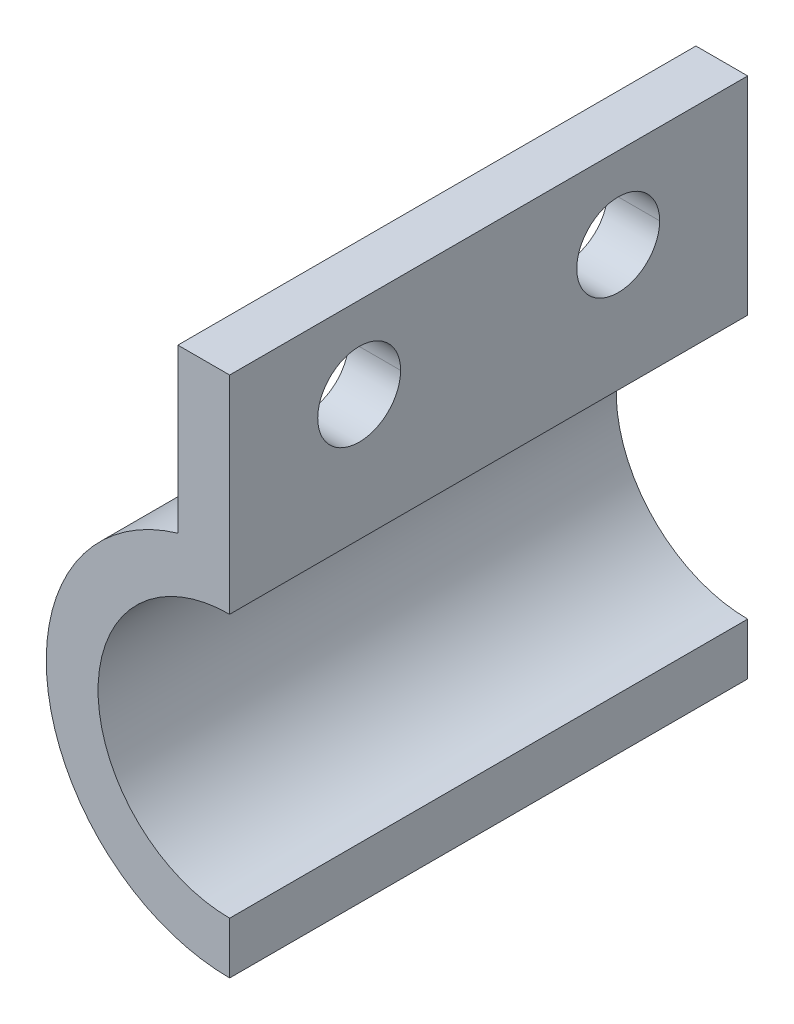
ISO-10303-21;
HEADER;
FILE_DESCRIPTION(('STEP AP214'),'2;1');
FILE_NAME('part.step','',(''),(''),'','','');
FILE_SCHEMA(('AUTOMOTIVE_DESIGN { 1 0 10303 214 1 1 1 1 }'));
ENDSEC;
DATA;
#1=APPLICATION_CONTEXT('core data for automotive mechanical design processes');
#2=APPLICATION_PROTOCOL_DEFINITION('international standard','automotive_design',2000,#1);
#3=PRODUCT_CONTEXT('',#1,'mechanical');
#4=PRODUCT('Part','Part','',(#3));
#5=PRODUCT_RELATED_PRODUCT_CATEGORY('part','',(#4));
#6=PRODUCT_DEFINITION_FORMATION('','',#4);
#7=PRODUCT_DEFINITION_CONTEXT('part definition',#1,'design');
#8=PRODUCT_DEFINITION('design','',#6,#7);
#9=PRODUCT_DEFINITION_SHAPE('','',#8);
#10=(LENGTH_UNIT() NAMED_UNIT(*) SI_UNIT(.MILLI.,.METRE.));
#11=(NAMED_UNIT(*) PLANE_ANGLE_UNIT() SI_UNIT($,.RADIAN.));
#12=(NAMED_UNIT(*) SI_UNIT($,.STERADIAN.) SOLID_ANGLE_UNIT());
#13=UNCERTAINTY_MEASURE_WITH_UNIT(LENGTH_MEASURE(1.E-05),#10,'distance_accuracy_value','');
#14=(GEOMETRIC_REPRESENTATION_CONTEXT(3) GLOBAL_UNCERTAINTY_ASSIGNED_CONTEXT((#13)) GLOBAL_UNIT_ASSIGNED_CONTEXT((#10,
#11,#12)) REPRESENTATION_CONTEXT('',''));
#15=CARTESIAN_POINT('',(0.,0.,0.));
#16=DIRECTION('',(0.,0.,1.));
#17=DIRECTION('',(1.,0.,0.));
#18=AXIS2_PLACEMENT_3D('',#15,#16,#17);
#19=CARTESIAN_POINT('',(-5.,24.8395524028066,37.5));
#20=DIRECTION('',(-1.,0.,0.));
#21=DIRECTION('',(0.,0.,1.));
#22=AXIS2_PLACEMENT_3D('',#19,#20,#21);
#23=CYLINDRICAL_SURFACE('',#22,4.);
#24=DIRECTION('',(1.,0.,0.));
#25=VECTOR('',#24,1.);
#26=CARTESIAN_POINT('',(-5.,24.8395524028066,33.5));
#27=LINE('',#26,#25);
#28=CARTESIAN_POINT('',(-5.,24.8395524028066,33.5));
#29=VERTEX_POINT('',#28);
#30=CARTESIAN_POINT('',(0.,24.8395524028066,33.5));
#31=VERTEX_POINT('',#30);
#32=EDGE_CURVE('E20',#29,#31,#27,.T.);
#33=ORIENTED_EDGE('',*,*,#32,.F.);
#34=CARTESIAN_POINT('',(-5.,24.8395524028066,37.5));
#35=DIRECTION('',(-1.,0.,0.));
#36=DIRECTION('',(0.,0.,-1.));
#37=AXIS2_PLACEMENT_3D('',#34,#35,#36);
#38=CIRCLE('',#37,4.);
#39=CARTESIAN_POINT('',(-5.,24.8395524028066,41.5));
#40=VERTEX_POINT('',#39);
#41=EDGE_CURVE('E34',#29,#40,#38,.T.);
#42=ORIENTED_EDGE('',*,*,#41,.T.);
#43=DIRECTION('',(1.,0.,0.));
#44=VECTOR('',#43,1.);
#45=CARTESIAN_POINT('',(-5.,24.8395524028066,41.5));
#46=LINE('',#45,#44);
#47=CARTESIAN_POINT('',(0.,24.8395524028066,41.5));
#48=VERTEX_POINT('',#47);
#49=EDGE_CURVE('E11',#40,#48,#46,.T.);
#50=ORIENTED_EDGE('',*,*,#49,.T.);
#51=CARTESIAN_POINT('',(0.,24.8395524028066,37.5));
#52=DIRECTION('',(-1.,0.,0.));
#53=DIRECTION('',(0.,0.,-1.));
#54=AXIS2_PLACEMENT_3D('',#51,#52,#53);
#55=CIRCLE('',#54,4.);
#56=EDGE_CURVE('E133',#31,#48,#55,.T.);
#57=ORIENTED_EDGE('',*,*,#56,.F.);
#58=EDGE_LOOP('',(#33,#42,#50,#57));
#59=FACE_BOUND('',#58,.T.);
#60=ADVANCED_FACE('F17',(#59),#23,.F.);
#61=CARTESIAN_POINT('',(-5.,24.8395524028066,37.5));
#62=DIRECTION('',(-1.,0.,0.));
#63=DIRECTION('',(0.,0.,1.));
#64=AXIS2_PLACEMENT_3D('',#61,#62,#63);
#65=CYLINDRICAL_SURFACE('',#64,4.);
#66=ORIENTED_EDGE('',*,*,#49,.F.);
#67=CARTESIAN_POINT('',(-5.,24.8395524028066,37.5));
#68=DIRECTION('',(-1.,0.,0.));
#69=DIRECTION('',(0.,0.,1.));
#70=AXIS2_PLACEMENT_3D('',#67,#68,#69);
#71=CIRCLE('',#70,4.);
#72=EDGE_CURVE('E155',#40,#29,#71,.T.);
#73=ORIENTED_EDGE('',*,*,#72,.T.);
#74=ORIENTED_EDGE('',*,*,#32,.T.);
#75=CARTESIAN_POINT('',(0.,24.8395524028066,37.5));
#76=DIRECTION('',(-1.,0.,0.));
#77=DIRECTION('',(0.,0.,1.));
#78=AXIS2_PLACEMENT_3D('',#75,#76,#77);
#79=CIRCLE('',#78,4.);
#80=EDGE_CURVE('E130',#48,#31,#79,.T.);
#81=ORIENTED_EDGE('',*,*,#80,.F.);
#82=EDGE_LOOP('',(#66,#73,#74,#81));
#83=FACE_BOUND('',#82,.T.);
#84=ADVANCED_FACE('F211',(#83),#65,.F.);
#85=CARTESIAN_POINT('',(-5.,24.8395524028066,12.5));
#86=DIRECTION('',(-1.,0.,0.));
#87=DIRECTION('',(0.,0.,1.));
#88=AXIS2_PLACEMENT_3D('',#85,#86,#87);
#89=CYLINDRICAL_SURFACE('',#88,4.);
#90=DIRECTION('',(1.,0.,0.));
#91=VECTOR('',#90,1.);
#92=CARTESIAN_POINT('',(-5.,24.8395524028066,8.5));
#93=LINE('',#92,#91);
#94=CARTESIAN_POINT('',(-5.,24.8395524028066,8.5));
#95=VERTEX_POINT('',#94);
#96=CARTESIAN_POINT('',(0.,24.8395524028066,8.5));
#97=VERTEX_POINT('',#96);
#98=EDGE_CURVE('E166',#95,#97,#93,.T.);
#99=ORIENTED_EDGE('',*,*,#98,.F.);
#100=CARTESIAN_POINT('',(-5.,24.8395524028066,12.5));
#101=DIRECTION('',(-1.,0.,0.));
#102=DIRECTION('',(0.,0.,-1.));
#103=AXIS2_PLACEMENT_3D('',#100,#101,#102);
#104=CIRCLE('',#103,4.);
#105=CARTESIAN_POINT('',(-5.,24.8395524028066,16.5));
#106=VERTEX_POINT('',#105);
#107=EDGE_CURVE('E153',#95,#106,#104,.T.);
#108=ORIENTED_EDGE('',*,*,#107,.T.);
#109=DIRECTION('',(1.,0.,0.));
#110=VECTOR('',#109,1.);
#111=CARTESIAN_POINT('',(-5.,24.8395524028066,16.5));
#112=LINE('',#111,#110);
#113=CARTESIAN_POINT('',(0.,24.8395524028066,16.5));
#114=VERTEX_POINT('',#113);
#115=EDGE_CURVE('E167',#106,#114,#112,.T.);
#116=ORIENTED_EDGE('',*,*,#115,.T.);
#117=CARTESIAN_POINT('',(0.,24.8395524028066,12.5));
#118=DIRECTION('',(-1.,0.,0.));
#119=DIRECTION('',(0.,0.,-1.));
#120=AXIS2_PLACEMENT_3D('',#117,#118,#119);
#121=CIRCLE('',#120,4.);
#122=EDGE_CURVE('E126',#97,#114,#121,.T.);
#123=ORIENTED_EDGE('',*,*,#122,.F.);
#124=EDGE_LOOP('',(#99,#108,#116,#123));
#125=FACE_BOUND('',#124,.T.);
#126=ADVANCED_FACE('F178',(#125),#89,.F.);
#127=CARTESIAN_POINT('',(-5.,24.8395524028066,12.5));
#128=DIRECTION('',(-1.,0.,0.));
#129=DIRECTION('',(0.,0.,1.));
#130=AXIS2_PLACEMENT_3D('',#127,#128,#129);
#131=CYLINDRICAL_SURFACE('',#130,4.);
#132=ORIENTED_EDGE('',*,*,#115,.F.);
#133=CARTESIAN_POINT('',(-5.,24.8395524028066,12.5));
#134=DIRECTION('',(-1.,0.,0.));
#135=DIRECTION('',(0.,0.,1.));
#136=AXIS2_PLACEMENT_3D('',#133,#134,#135);
#137=CIRCLE('',#136,4.);
#138=EDGE_CURVE('E150',#106,#95,#137,.T.);
#139=ORIENTED_EDGE('',*,*,#138,.T.);
#140=ORIENTED_EDGE('',*,*,#98,.T.);
#141=CARTESIAN_POINT('',(0.,24.8395524028066,12.5));
#142=DIRECTION('',(-1.,0.,0.));
#143=DIRECTION('',(0.,0.,1.));
#144=AXIS2_PLACEMENT_3D('',#141,#142,#143);
#145=CIRCLE('',#144,4.);
#146=EDGE_CURVE('E123',#114,#97,#145,.T.);
#147=ORIENTED_EDGE('',*,*,#146,.F.);
#148=EDGE_LOOP('',(#132,#139,#140,#147));
#149=FACE_BOUND('',#148,.T.);
#150=ADVANCED_FACE('F173',(#149),#131,.F.);
#151=CARTESIAN_POINT('',(0.,0.,50.));
#152=DIRECTION('',(0.,0.,1.));
#153=DIRECTION('',(1.,0.,0.));
#154=AXIS2_PLACEMENT_3D('',#151,#152,#153);
#155=PLANE('',#154);
#156=DIRECTION('',(-1.,0.,0.));
#157=VECTOR('',#156,1.);
#158=CARTESIAN_POINT('',(0.,32.7,50.));
#159=LINE('',#158,#157);
#160=CARTESIAN_POINT('',(0.,32.7,50.));
#161=VERTEX_POINT('',#160);
#162=CARTESIAN_POINT('',(-5.,32.7,50.));
#163=VERTEX_POINT('',#162);
#164=EDGE_CURVE('E158',#161,#163,#159,.T.);
#165=ORIENTED_EDGE('',*,*,#164,.T.);
#166=DIRECTION('',(0.,-1.,0.));
#167=VECTOR('',#166,1.);
#168=CARTESIAN_POINT('',(-5.,32.7,50.));
#169=LINE('',#168,#167);
#170=CARTESIAN_POINT('',(-5.,16.9791048056133,50.));
#171=VERTEX_POINT('',#170);
#172=EDGE_CURVE('E149',#163,#171,#169,.T.);
#173=ORIENTED_EDGE('',*,*,#172,.T.);
#174=CARTESIAN_POINT('',(0.,0.,50.));
#175=DIRECTION('',(0.,0.,1.));
#176=DIRECTION('',(-0.282485875706215,0.959271457944253,0.));
#177=AXIS2_PLACEMENT_3D('',#174,#175,#176);
#178=CIRCLE('',#177,17.7);
#179=CARTESIAN_POINT('',(0.,-17.7,50.));
#180=VERTEX_POINT('',#179);
#181=EDGE_CURVE('E145',#171,#180,#178,.T.);
#182=ORIENTED_EDGE('',*,*,#181,.T.);
#183=DIRECTION('',(0.,1.,0.));
#184=VECTOR('',#183,1.);
#185=CARTESIAN_POINT('',(0.,-17.7,50.));
#186=LINE('',#185,#184);
#187=CARTESIAN_POINT('',(0.,-12.7,50.));
#188=VERTEX_POINT('',#187);
#189=EDGE_CURVE('E141',#180,#188,#186,.T.);
#190=ORIENTED_EDGE('',*,*,#189,.T.);
#191=CARTESIAN_POINT('',(0.,0.,50.));
#192=DIRECTION('',(0.,0.,-1.));
#193=DIRECTION('',(0.,-1.,0.));
#194=AXIS2_PLACEMENT_3D('',#191,#192,#193);
#195=CIRCLE('',#194,12.7);
#196=CARTESIAN_POINT('',(0.,12.7,50.));
#197=VERTEX_POINT('',#196);
#198=EDGE_CURVE('E137',#188,#197,#195,.T.);
#199=ORIENTED_EDGE('',*,*,#198,.T.);
#200=DIRECTION('',(0.,1.,0.));
#201=VECTOR('',#200,1.);
#202=CARTESIAN_POINT('',(0.,12.7,50.));
#203=LINE('',#202,#201);
#204=EDGE_CURVE('E110',#197,#161,#203,.T.);
#205=ORIENTED_EDGE('',*,*,#204,.T.);
#206=EDGE_LOOP('',(#165,#173,#182,#190,#199,#205));
#207=FACE_BOUND('',#206,.T.);
#208=ADVANCED_FACE('F196',(#207),#155,.T.);
#209=CARTESIAN_POINT('',(0.,32.7,0.));
#210=DIRECTION('',(0.,1.,0.));
#211=DIRECTION('',(-1.,0.,0.));
#212=AXIS2_PLACEMENT_3D('',#209,#210,#211);
#213=PLANE('',#212);
#214=DIRECTION('',(0.,0.,1.));
#215=VECTOR('',#214,1.);
#216=CARTESIAN_POINT('',(-5.,32.7,0.));
#217=LINE('',#216,#215);
#218=CARTESIAN_POINT('',(-5.,32.7,0.));
#219=VERTEX_POINT('',#218);
#220=EDGE_CURVE('E146',#219,#163,#217,.T.);
#221=ORIENTED_EDGE('',*,*,#220,.T.);
#222=ORIENTED_EDGE('',*,*,#164,.F.);
#223=DIRECTION('',(0.,0.,1.));
#224=VECTOR('',#223,1.);
#225=CARTESIAN_POINT('',(0.,32.7,0.));
#226=LINE('',#225,#224);
#227=CARTESIAN_POINT('',(0.,32.7,0.));
#228=VERTEX_POINT('',#227);
#229=EDGE_CURVE('E127',#228,#161,#226,.T.);
#230=ORIENTED_EDGE('',*,*,#229,.F.);
#231=DIRECTION('',(-1.,0.,0.));
#232=VECTOR('',#231,1.);
#233=CARTESIAN_POINT('',(0.,32.7,0.));
#234=LINE('',#233,#232);
#235=EDGE_CURVE('E114',#228,#219,#234,.T.);
#236=ORIENTED_EDGE('',*,*,#235,.T.);
#237=EDGE_LOOP('',(#221,#222,#230,#236));
#238=FACE_BOUND('',#237,.T.);
#239=ADVANCED_FACE('F184',(#238),#213,.T.);
#240=CARTESIAN_POINT('',(-5.,32.7,0.));
#241=DIRECTION('',(-1.,0.,0.));
#242=DIRECTION('',(0.,-1.,0.));
#243=AXIS2_PLACEMENT_3D('',#240,#241,#242);
#244=PLANE('',#243);
#245=ORIENTED_EDGE('',*,*,#41,.F.);
#246=ORIENTED_EDGE('',*,*,#72,.F.);
#247=EDGE_LOOP('',(#245,#246));
#248=FACE_BOUND('',#247,.T.);
#249=ORIENTED_EDGE('',*,*,#107,.F.);
#250=ORIENTED_EDGE('',*,*,#138,.F.);
#251=EDGE_LOOP('',(#249,#250));
#252=FACE_BOUND('',#251,.T.);
#253=DIRECTION('',(0.,0.,1.));
#254=VECTOR('',#253,1.);
#255=CARTESIAN_POINT('',(-5.,16.9791048056133,0.));
#256=LINE('',#255,#254);
#257=CARTESIAN_POINT('',(-5.,16.9791048056133,0.));
#258=VERTEX_POINT('',#257);
#259=EDGE_CURVE('E142',#258,#171,#256,.T.);
#260=ORIENTED_EDGE('',*,*,#259,.T.);
#261=ORIENTED_EDGE('',*,*,#172,.F.);
#262=ORIENTED_EDGE('',*,*,#220,.F.);
#263=DIRECTION('',(0.,-1.,0.));
#264=VECTOR('',#263,1.);
#265=CARTESIAN_POINT('',(-5.,32.7,0.));
#266=LINE('',#265,#264);
#267=EDGE_CURVE('E116',#219,#258,#266,.T.);
#268=ORIENTED_EDGE('',*,*,#267,.T.);
#269=EDGE_LOOP('',(#260,#261,#262,#268));
#270=FACE_BOUND('',#269,.T.);
#271=ADVANCED_FACE('F180',(#248,#252,#270),#244,.T.);
#272=CARTESIAN_POINT('',(0.,0.,0.));
#273=DIRECTION('',(0.,0.,1.));
#274=DIRECTION('',(1.,0.,0.));
#275=AXIS2_PLACEMENT_3D('',#272,#273,#274);
#276=CYLINDRICAL_SURFACE('',#275,17.7);
#277=DIRECTION('',(0.,0.,1.));
#278=VECTOR('',#277,1.);
#279=CARTESIAN_POINT('',(0.,-17.7,0.));
#280=LINE('',#279,#278);
#281=CARTESIAN_POINT('',(0.,-17.7,0.));
#282=VERTEX_POINT('',#281);
#283=EDGE_CURVE('E138',#282,#180,#280,.T.);
#284=ORIENTED_EDGE('',*,*,#283,.T.);
#285=ORIENTED_EDGE('',*,*,#181,.F.);
#286=ORIENTED_EDGE('',*,*,#259,.F.);
#287=CARTESIAN_POINT('',(0.,0.,0.));
#288=DIRECTION('',(0.,0.,1.));
#289=DIRECTION('',(-0.282485875706215,0.959271457944253,0.));
#290=AXIS2_PLACEMENT_3D('',#287,#288,#289);
#291=CIRCLE('',#290,17.7);
#292=EDGE_CURVE('E120',#258,#282,#291,.T.);
#293=ORIENTED_EDGE('',*,*,#292,.T.);
#294=EDGE_LOOP('',(#284,#285,#286,#293));
#295=FACE_BOUND('',#294,.T.);
#296=ADVANCED_FACE('F183',(#295),#276,.T.);
#297=CARTESIAN_POINT('',(0.,-17.7,0.));
#298=DIRECTION('',(1.,0.,0.));
#299=DIRECTION('',(0.,1.,0.));
#300=AXIS2_PLACEMENT_3D('',#297,#298,#299);
#301=PLANE('',#300);
#302=DIRECTION('',(0.,0.,1.));
#303=VECTOR('',#302,1.);
#304=CARTESIAN_POINT('',(0.,-12.7,0.));
#305=LINE('',#304,#303);
#306=CARTESIAN_POINT('',(0.,-12.7,0.));
#307=VERTEX_POINT('',#306);
#308=EDGE_CURVE('E98',#307,#188,#305,.T.);
#309=ORIENTED_EDGE('',*,*,#308,.T.);
#310=ORIENTED_EDGE('',*,*,#189,.F.);
#311=ORIENTED_EDGE('',*,*,#283,.F.);
#312=DIRECTION('',(0.,1.,0.));
#313=VECTOR('',#312,1.);
#314=CARTESIAN_POINT('',(0.,-17.7,0.));
#315=LINE('',#314,#313);
#316=EDGE_CURVE('E102',#282,#307,#315,.T.);
#317=ORIENTED_EDGE('',*,*,#316,.T.);
#318=EDGE_LOOP('',(#309,#310,#311,#317));
#319=FACE_BOUND('',#318,.T.);
#320=ADVANCED_FACE('F200',(#319),#301,.T.);
#321=CARTESIAN_POINT('',(0.,0.,0.));
#322=DIRECTION('',(0.,0.,1.));
#323=DIRECTION('',(1.,0.,0.));
#324=AXIS2_PLACEMENT_3D('',#321,#322,#323);
#325=CYLINDRICAL_SURFACE('',#324,12.7);
#326=DIRECTION('',(0.,0.,1.));
#327=VECTOR('',#326,1.);
#328=CARTESIAN_POINT('',(0.,12.7,0.));
#329=LINE('',#328,#327);
#330=CARTESIAN_POINT('',(0.,12.7,0.));
#331=VERTEX_POINT('',#330);
#332=EDGE_CURVE('E95',#331,#197,#329,.T.);
#333=ORIENTED_EDGE('',*,*,#332,.T.);
#334=ORIENTED_EDGE('',*,*,#198,.F.);
#335=ORIENTED_EDGE('',*,*,#308,.F.);
#336=CARTESIAN_POINT('',(0.,0.,0.));
#337=DIRECTION('',(0.,0.,-1.));
#338=DIRECTION('',(0.,-1.,0.));
#339=AXIS2_PLACEMENT_3D('',#336,#337,#338);
#340=CIRCLE('',#339,12.7);
#341=EDGE_CURVE('E91',#307,#331,#340,.T.);
#342=ORIENTED_EDGE('',*,*,#341,.T.);
#343=EDGE_LOOP('',(#333,#334,#335,#342));
#344=FACE_BOUND('',#343,.T.);
#345=ADVANCED_FACE('F93',(#344),#325,.F.);
#346=CARTESIAN_POINT('',(0.,12.7,0.));
#347=DIRECTION('',(1.,0.,0.));
#348=DIRECTION('',(0.,1.,0.));
#349=AXIS2_PLACEMENT_3D('',#346,#347,#348);
#350=PLANE('',#349);
#351=ORIENTED_EDGE('',*,*,#56,.T.);
#352=ORIENTED_EDGE('',*,*,#80,.T.);
#353=EDGE_LOOP('',(#351,#352));
#354=FACE_BOUND('',#353,.T.);
#355=ORIENTED_EDGE('',*,*,#122,.T.);
#356=ORIENTED_EDGE('',*,*,#146,.T.);
#357=EDGE_LOOP('',(#355,#356));
#358=FACE_BOUND('',#357,.T.);
#359=ORIENTED_EDGE('',*,*,#229,.T.);
#360=ORIENTED_EDGE('',*,*,#204,.F.);
#361=ORIENTED_EDGE('',*,*,#332,.F.);
#362=DIRECTION('',(0.,1.,0.));
#363=VECTOR('',#362,1.);
#364=CARTESIAN_POINT('',(0.,12.7,0.));
#365=LINE('',#364,#363);
#366=EDGE_CURVE('E108',#331,#228,#365,.T.);
#367=ORIENTED_EDGE('',*,*,#366,.T.);
#368=EDGE_LOOP('',(#359,#360,#361,#367));
#369=FACE_BOUND('',#368,.T.);
#370=ADVANCED_FACE('F107',(#354,#358,#369),#350,.T.);
#371=CARTESIAN_POINT('',(0.,0.,0.));
#372=DIRECTION('',(0.,0.,1.));
#373=DIRECTION('',(1.,0.,0.));
#374=AXIS2_PLACEMENT_3D('',#371,#372,#373);
#375=PLANE('',#374);
#376=ORIENTED_EDGE('',*,*,#341,.F.);
#377=ORIENTED_EDGE('',*,*,#316,.F.);
#378=ORIENTED_EDGE('',*,*,#292,.F.);
#379=ORIENTED_EDGE('',*,*,#267,.F.);
#380=ORIENTED_EDGE('',*,*,#235,.F.);
#381=ORIENTED_EDGE('',*,*,#366,.F.);
#382=EDGE_LOOP('',(#376,#377,#378,#379,#380,#381));
#383=FACE_BOUND('',#382,.T.);
#384=ADVANCED_FACE('F112',(#383),#375,.F.);
#385=CLOSED_SHELL('',(#60,#84,#126,#150,#208,#239,#271,#296,#320,#345,#370,#384));
#386=MANIFOLD_SOLID_BREP('B1',#385);
#387=ADVANCED_BREP_SHAPE_REPRESENTATION('',(#18,#386),#14);
#388=SHAPE_DEFINITION_REPRESENTATION(#9,#387);
ENDSEC;
END-ISO-10303-21;
